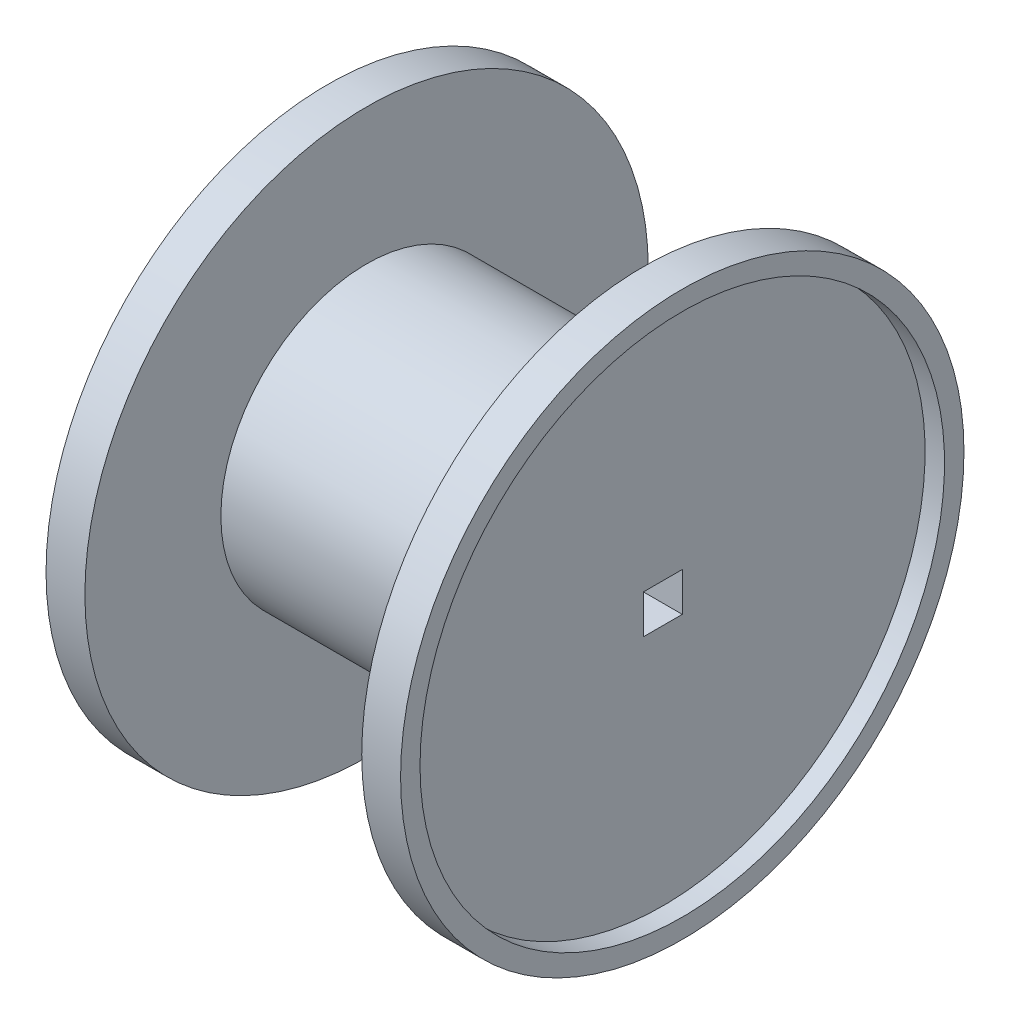
ISO-10303-21;
HEADER;
FILE_DESCRIPTION(('STEP AP214'),'2;1');
FILE_NAME('part.step','',(''),(''),'','','');
FILE_SCHEMA(('AUTOMOTIVE_DESIGN { 1 0 10303 214 1 1 1 1 }'));
ENDSEC;
DATA;
#1=APPLICATION_CONTEXT('core data for automotive mechanical design processes');
#2=APPLICATION_PROTOCOL_DEFINITION('international standard','automotive_design',2000,#1);
#3=PRODUCT_CONTEXT('',#1,'mechanical');
#4=PRODUCT('Part','Part','',(#3));
#5=PRODUCT_RELATED_PRODUCT_CATEGORY('part','',(#4));
#6=PRODUCT_DEFINITION_FORMATION('','',#4);
#7=PRODUCT_DEFINITION_CONTEXT('part definition',#1,'design');
#8=PRODUCT_DEFINITION('design','',#6,#7);
#9=PRODUCT_DEFINITION_SHAPE('','',#8);
#10=(LENGTH_UNIT() NAMED_UNIT(*) SI_UNIT(.MILLI.,.METRE.));
#11=(NAMED_UNIT(*) PLANE_ANGLE_UNIT() SI_UNIT($,.RADIAN.));
#12=(NAMED_UNIT(*) SI_UNIT($,.STERADIAN.) SOLID_ANGLE_UNIT());
#13=UNCERTAINTY_MEASURE_WITH_UNIT(LENGTH_MEASURE(1.E-05),#10,'distance_accuracy_value','');
#14=(GEOMETRIC_REPRESENTATION_CONTEXT(3) GLOBAL_UNCERTAINTY_ASSIGNED_CONTEXT((#13)) GLOBAL_UNIT_ASSIGNED_CONTEXT((#10,
#11,#12)) REPRESENTATION_CONTEXT('',''));
#15=CARTESIAN_POINT('',(0.,0.,0.));
#16=DIRECTION('',(0.,0.,1.));
#17=DIRECTION('',(1.,0.,0.));
#18=AXIS2_PLACEMENT_3D('',#15,#16,#17);
#19=CARTESIAN_POINT('',(0.,0.,0.));
#20=DIRECTION('',(-1.,0.,0.));
#21=DIRECTION('',(0.,0.,1.));
#22=AXIS2_PLACEMENT_3D('',#19,#20,#21);
#23=PLANE('',#22);
#24=DIRECTION('',(0.,-1.,0.));
#25=VECTOR('',#24,1.);
#26=CARTESIAN_POINT('',(0.,20.,-20.));
#27=LINE('',#26,#25);
#28=CARTESIAN_POINT('',(0.,20.,-20.));
#29=VERTEX_POINT('',#28);
#30=CARTESIAN_POINT('',(0.,-20.,-20.));
#31=VERTEX_POINT('',#30);
#32=EDGE_CURVE('E55',#29,#31,#27,.T.);
#33=ORIENTED_EDGE('',*,*,#32,.F.);
#34=DIRECTION('',(0.,0.,-1.));
#35=VECTOR('',#34,1.);
#36=CARTESIAN_POINT('',(0.,20.,-20.));
#37=LINE('',#36,#35);
#38=CARTESIAN_POINT('',(0.,20.,20.));
#39=VERTEX_POINT('',#38);
#40=EDGE_CURVE('E98',#39,#29,#37,.T.);
#41=ORIENTED_EDGE('',*,*,#40,.F.);
#42=DIRECTION('',(0.,1.,0.));
#43=VECTOR('',#42,1.);
#44=CARTESIAN_POINT('',(0.,20.,20.));
#45=LINE('',#44,#43);
#46=CARTESIAN_POINT('',(0.,-20.,20.));
#47=VERTEX_POINT('',#46);
#48=EDGE_CURVE('E83',#47,#39,#45,.T.);
#49=ORIENTED_EDGE('',*,*,#48,.F.);
#50=DIRECTION('',(0.,0.,1.));
#51=VECTOR('',#50,1.);
#52=CARTESIAN_POINT('',(0.,-20.,-20.));
#53=LINE('',#52,#51);
#54=EDGE_CURVE('E92',#31,#47,#53,.T.);
#55=ORIENTED_EDGE('',*,*,#54,.F.);
#56=EDGE_LOOP('',(#33,#41,#49,#55));
#57=FACE_BOUND('',#56,.T.);
#58=CARTESIAN_POINT('',(0.,0.,0.));
#59=DIRECTION('',(-1.,0.,0.));
#60=DIRECTION('',(0.,0.,1.));
#61=AXIS2_PLACEMENT_3D('',#58,#59,#60);
#62=CIRCLE('',#61,270.);
#63=CARTESIAN_POINT('',(0.,0.,270.));
#64=VERTEX_POINT('',#63);
#65=EDGE_CURVE('E105',#64,#64,#62,.T.);
#66=ORIENTED_EDGE('',*,*,#65,.T.);
#67=EDGE_LOOP('',(#66));
#68=FACE_BOUND('',#67,.T.);
#69=ADVANCED_FACE('F41',(#57,#68),#23,.T.);
#70=CARTESIAN_POINT('',(325.,0.,0.));
#71=DIRECTION('',(1.,0.,0.));
#72=DIRECTION('',(0.,0.,-1.));
#73=AXIS2_PLACEMENT_3D('',#70,#71,#72);
#74=PLANE('',#73);
#75=DIRECTION('',(0.,1.,0.));
#76=VECTOR('',#75,1.);
#77=CARTESIAN_POINT('',(325.,0.,-20.));
#78=LINE('',#77,#76);
#79=CARTESIAN_POINT('',(325.,-20.,-20.));
#80=VERTEX_POINT('',#79);
#81=CARTESIAN_POINT('',(325.,20.,-20.));
#82=VERTEX_POINT('',#81);
#83=EDGE_CURVE('E11',#80,#82,#78,.T.);
#84=ORIENTED_EDGE('',*,*,#83,.F.);
#85=DIRECTION('',(0.,0.,-1.));
#86=VECTOR('',#85,1.);
#87=CARTESIAN_POINT('',(325.,-20.,0.));
#88=LINE('',#87,#86);
#89=CARTESIAN_POINT('',(325.,-20.,20.));
#90=VERTEX_POINT('',#89);
#91=EDGE_CURVE('E137',#90,#80,#88,.T.);
#92=ORIENTED_EDGE('',*,*,#91,.F.);
#93=DIRECTION('',(0.,-1.,0.));
#94=VECTOR('',#93,1.);
#95=CARTESIAN_POINT('',(325.,0.,20.));
#96=LINE('',#95,#94);
#97=CARTESIAN_POINT('',(325.,20.,20.));
#98=VERTEX_POINT('',#97);
#99=EDGE_CURVE('E86',#98,#90,#96,.T.);
#100=ORIENTED_EDGE('',*,*,#99,.F.);
#101=DIRECTION('',(0.,0.,1.));
#102=VECTOR('',#101,1.);
#103=CARTESIAN_POINT('',(325.,20.,0.));
#104=LINE('',#103,#102);
#105=EDGE_CURVE('E48',#82,#98,#104,.T.);
#106=ORIENTED_EDGE('',*,*,#105,.F.);
#107=EDGE_LOOP('',(#84,#92,#100,#106));
#108=FACE_BOUND('',#107,.T.);
#109=CARTESIAN_POINT('',(325.,0.,0.));
#110=DIRECTION('',(-1.,0.,0.));
#111=DIRECTION('',(0.,0.,1.));
#112=AXIS2_PLACEMENT_3D('',#109,#110,#111);
#113=CIRCLE('',#112,270.);
#114=CARTESIAN_POINT('',(325.,0.,270.));
#115=VERTEX_POINT('',#114);
#116=EDGE_CURVE('E134',#115,#115,#113,.T.);
#117=ORIENTED_EDGE('',*,*,#116,.F.);
#118=EDGE_LOOP('',(#117));
#119=FACE_BOUND('',#118,.T.);
#120=ADVANCED_FACE('F145',(#108,#119),#74,.T.);
#121=CARTESIAN_POINT('',(0.,0.,0.));
#122=DIRECTION('',(-1.,0.,0.));
#123=DIRECTION('',(0.,0.,1.));
#124=AXIS2_PLACEMENT_3D('',#121,#122,#123);
#125=CYLINDRICAL_SURFACE('',#124,270.);
#126=CARTESIAN_POINT('',(345.,0.,0.));
#127=DIRECTION('',(-1.,0.,0.));
#128=DIRECTION('',(0.,0.,1.));
#129=AXIS2_PLACEMENT_3D('',#126,#127,#128);
#130=CIRCLE('',#129,270.);
#131=CARTESIAN_POINT('',(345.,0.,270.));
#132=VERTEX_POINT('',#131);
#133=EDGE_CURVE('E131',#132,#132,#130,.T.);
#134=ORIENTED_EDGE('',*,*,#133,.F.);
#135=EDGE_LOOP('',(#134));
#136=FACE_BOUND('',#135,.T.);
#137=ORIENTED_EDGE('',*,*,#116,.T.);
#138=EDGE_LOOP('',(#137));
#139=FACE_BOUND('',#138,.T.);
#140=ADVANCED_FACE('F164',(#136,#139),#125,.F.);
#141=CARTESIAN_POINT('',(345.,0.,0.));
#142=DIRECTION('',(1.,0.,0.));
#143=DIRECTION('',(0.,0.,-1.));
#144=AXIS2_PLACEMENT_3D('',#141,#142,#143);
#145=PLANE('',#144);
#146=ORIENTED_EDGE('',*,*,#133,.T.);
#147=EDGE_LOOP('',(#146));
#148=FACE_BOUND('',#147,.T.);
#149=CARTESIAN_POINT('',(345.,0.,0.));
#150=DIRECTION('',(-1.,0.,0.));
#151=DIRECTION('',(0.,0.,1.));
#152=AXIS2_PLACEMENT_3D('',#149,#150,#151);
#153=CIRCLE('',#152,290.);
#154=CARTESIAN_POINT('',(345.,0.,290.));
#155=VERTEX_POINT('',#154);
#156=EDGE_CURVE('E128',#155,#155,#153,.T.);
#157=ORIENTED_EDGE('',*,*,#156,.F.);
#158=EDGE_LOOP('',(#157));
#159=FACE_BOUND('',#158,.T.);
#160=ADVANCED_FACE('F168',(#148,#159),#145,.T.);
#161=CARTESIAN_POINT('',(0.,0.,0.));
#162=DIRECTION('',(-1.,0.,0.));
#163=DIRECTION('',(0.,0.,1.));
#164=AXIS2_PLACEMENT_3D('',#161,#162,#163);
#165=CYLINDRICAL_SURFACE('',#164,290.);
#166=ORIENTED_EDGE('',*,*,#156,.T.);
#167=EDGE_LOOP('',(#166));
#168=FACE_BOUND('',#167,.T.);
#169=CARTESIAN_POINT('',(305.,0.,0.));
#170=DIRECTION('',(-1.,0.,0.));
#171=DIRECTION('',(0.,0.,1.));
#172=AXIS2_PLACEMENT_3D('',#169,#170,#171);
#173=CIRCLE('',#172,290.);
#174=CARTESIAN_POINT('',(305.,0.,290.));
#175=VERTEX_POINT('',#174);
#176=EDGE_CURVE('E125',#175,#175,#173,.T.);
#177=ORIENTED_EDGE('',*,*,#176,.F.);
#178=EDGE_LOOP('',(#177));
#179=FACE_BOUND('',#178,.T.);
#180=ADVANCED_FACE('F174',(#168,#179),#165,.T.);
#181=CARTESIAN_POINT('',(305.,0.,0.));
#182=DIRECTION('',(-1.,0.,0.));
#183=DIRECTION('',(0.,0.,1.));
#184=AXIS2_PLACEMENT_3D('',#181,#182,#183);
#185=PLANE('',#184);
#186=ORIENTED_EDGE('',*,*,#176,.T.);
#187=EDGE_LOOP('',(#186));
#188=FACE_BOUND('',#187,.T.);
#189=CARTESIAN_POINT('',(305.,0.,0.));
#190=DIRECTION('',(-1.,0.,0.));
#191=DIRECTION('',(0.,0.,1.));
#192=AXIS2_PLACEMENT_3D('',#189,#190,#191);
#193=CIRCLE('',#192,150.);
#194=CARTESIAN_POINT('',(305.,0.,150.));
#195=VERTEX_POINT('',#194);
#196=EDGE_CURVE('E122',#195,#195,#193,.T.);
#197=ORIENTED_EDGE('',*,*,#196,.F.);
#198=EDGE_LOOP('',(#197));
#199=FACE_BOUND('',#198,.T.);
#200=ADVANCED_FACE('F178',(#188,#199),#185,.T.);
#201=CARTESIAN_POINT('',(0.,0.,0.));
#202=DIRECTION('',(-1.,0.,0.));
#203=DIRECTION('',(0.,0.,1.));
#204=AXIS2_PLACEMENT_3D('',#201,#202,#203);
#205=CYLINDRICAL_SURFACE('',#204,150.);
#206=ORIENTED_EDGE('',*,*,#196,.T.);
#207=EDGE_LOOP('',(#206));
#208=FACE_BOUND('',#207,.T.);
#209=CARTESIAN_POINT('',(20.,0.,0.));
#210=DIRECTION('',(-1.,0.,0.));
#211=DIRECTION('',(0.,0.,1.));
#212=AXIS2_PLACEMENT_3D('',#209,#210,#211);
#213=CIRCLE('',#212,150.);
#214=CARTESIAN_POINT('',(20.,0.,150.));
#215=VERTEX_POINT('',#214);
#216=EDGE_CURVE('E119',#215,#215,#213,.T.);
#217=ORIENTED_EDGE('',*,*,#216,.F.);
#218=EDGE_LOOP('',(#217));
#219=FACE_BOUND('',#218,.T.);
#220=ADVANCED_FACE('F182',(#208,#219),#205,.T.);
#221=CARTESIAN_POINT('',(20.,0.,0.));
#222=DIRECTION('',(1.,0.,0.));
#223=DIRECTION('',(0.,0.,-1.));
#224=AXIS2_PLACEMENT_3D('',#221,#222,#223);
#225=PLANE('',#224);
#226=ORIENTED_EDGE('',*,*,#216,.T.);
#227=EDGE_LOOP('',(#226));
#228=FACE_BOUND('',#227,.T.);
#229=CARTESIAN_POINT('',(20.,0.,0.));
#230=DIRECTION('',(-1.,0.,0.));
#231=DIRECTION('',(0.,0.,1.));
#232=AXIS2_PLACEMENT_3D('',#229,#230,#231);
#233=CIRCLE('',#232,290.);
#234=CARTESIAN_POINT('',(20.,0.,290.));
#235=VERTEX_POINT('',#234);
#236=EDGE_CURVE('E116',#235,#235,#233,.T.);
#237=ORIENTED_EDGE('',*,*,#236,.F.);
#238=EDGE_LOOP('',(#237));
#239=FACE_BOUND('',#238,.T.);
#240=ADVANCED_FACE('F186',(#228,#239),#225,.T.);
#241=CARTESIAN_POINT('',(0.,0.,0.));
#242=DIRECTION('',(-1.,0.,0.));
#243=DIRECTION('',(0.,0.,1.));
#244=AXIS2_PLACEMENT_3D('',#241,#242,#243);
#245=CYLINDRICAL_SURFACE('',#244,290.);
#246=ORIENTED_EDGE('',*,*,#236,.T.);
#247=EDGE_LOOP('',(#246));
#248=FACE_BOUND('',#247,.T.);
#249=CARTESIAN_POINT('',(-20.,0.,0.));
#250=DIRECTION('',(-1.,0.,0.));
#251=DIRECTION('',(0.,0.,1.));
#252=AXIS2_PLACEMENT_3D('',#249,#250,#251);
#253=CIRCLE('',#252,290.);
#254=CARTESIAN_POINT('',(-20.,0.,290.));
#255=VERTEX_POINT('',#254);
#256=EDGE_CURVE('E113',#255,#255,#253,.T.);
#257=ORIENTED_EDGE('',*,*,#256,.F.);
#258=EDGE_LOOP('',(#257));
#259=FACE_BOUND('',#258,.T.);
#260=ADVANCED_FACE('F190',(#248,#259),#245,.T.);
#261=CARTESIAN_POINT('',(-20.,0.,0.));
#262=DIRECTION('',(1.,0.,0.));
#263=DIRECTION('',(0.,0.,-1.));
#264=AXIS2_PLACEMENT_3D('',#261,#262,#263);
#265=PLANE('',#264);
#266=CARTESIAN_POINT('',(-20.,0.,0.));
#267=DIRECTION('',(-1.,0.,0.));
#268=DIRECTION('',(0.,0.,1.));
#269=AXIS2_PLACEMENT_3D('',#266,#267,#268);
#270=CIRCLE('',#269,270.);
#271=CARTESIAN_POINT('',(-20.,0.,270.));
#272=VERTEX_POINT('',#271);
#273=EDGE_CURVE('E110',#272,#272,#270,.T.);
#274=ORIENTED_EDGE('',*,*,#273,.F.);
#275=EDGE_LOOP('',(#274));
#276=FACE_BOUND('',#275,.T.);
#277=ORIENTED_EDGE('',*,*,#256,.T.);
#278=EDGE_LOOP('',(#277));
#279=FACE_BOUND('',#278,.T.);
#280=ADVANCED_FACE('F156',(#276,#279),#265,.F.);
#281=CARTESIAN_POINT('',(0.,0.,0.));
#282=DIRECTION('',(-1.,0.,0.));
#283=DIRECTION('',(0.,0.,1.));
#284=AXIS2_PLACEMENT_3D('',#281,#282,#283);
#285=CYLINDRICAL_SURFACE('',#284,270.);
#286=ORIENTED_EDGE('',*,*,#273,.T.);
#287=EDGE_LOOP('',(#286));
#288=FACE_BOUND('',#287,.T.);
#289=ORIENTED_EDGE('',*,*,#65,.F.);
#290=EDGE_LOOP('',(#289));
#291=FACE_BOUND('',#290,.T.);
#292=ADVANCED_FACE('F149',(#288,#291),#285,.F.);
#293=CARTESIAN_POINT('',(345.,20.,-20.));
#294=DIRECTION('',(0.,0.,-1.));
#295=DIRECTION('',(0.,1.,0.));
#296=AXIS2_PLACEMENT_3D('',#293,#294,#295);
#297=PLANE('',#296);
#298=ORIENTED_EDGE('',*,*,#83,.T.);
#299=DIRECTION('',(-1.,0.,0.));
#300=VECTOR('',#299,1.);
#301=CARTESIAN_POINT('',(345.,20.,-20.));
#302=LINE('',#301,#300);
#303=EDGE_CURVE('E103',#82,#29,#302,.T.);
#304=ORIENTED_EDGE('',*,*,#303,.T.);
#305=ORIENTED_EDGE('',*,*,#32,.T.);
#306=DIRECTION('',(-1.,0.,0.));
#307=VECTOR('',#306,1.);
#308=CARTESIAN_POINT('',(345.,-20.,-20.));
#309=LINE('',#308,#307);
#310=EDGE_CURVE('E89',#80,#31,#309,.T.);
#311=ORIENTED_EDGE('',*,*,#310,.F.);
#312=EDGE_LOOP('',(#298,#304,#305,#311));
#313=FACE_BOUND('',#312,.T.);
#314=ADVANCED_FACE('F147',(#313),#297,.F.);
#315=CARTESIAN_POINT('',(345.,20.,-20.));
#316=DIRECTION('',(0.,1.,0.));
#317=DIRECTION('',(0.,0.,1.));
#318=AXIS2_PLACEMENT_3D('',#315,#316,#317);
#319=PLANE('',#318);
#320=ORIENTED_EDGE('',*,*,#105,.T.);
#321=DIRECTION('',(-1.,0.,0.));
#322=VECTOR('',#321,1.);
#323=CARTESIAN_POINT('',(345.,20.,20.));
#324=LINE('',#323,#322);
#325=EDGE_CURVE('E88',#98,#39,#324,.T.);
#326=ORIENTED_EDGE('',*,*,#325,.T.);
#327=ORIENTED_EDGE('',*,*,#40,.T.);
#328=ORIENTED_EDGE('',*,*,#303,.F.);
#329=EDGE_LOOP('',(#320,#326,#327,#328));
#330=FACE_BOUND('',#329,.T.);
#331=ADVANCED_FACE('F142',(#330),#319,.F.);
#332=CARTESIAN_POINT('',(345.,20.,20.));
#333=DIRECTION('',(0.,0.,1.));
#334=DIRECTION('',(0.,-1.,0.));
#335=AXIS2_PLACEMENT_3D('',#332,#333,#334);
#336=PLANE('',#335);
#337=ORIENTED_EDGE('',*,*,#99,.T.);
#338=DIRECTION('',(-1.,0.,0.));
#339=VECTOR('',#338,1.);
#340=CARTESIAN_POINT('',(345.,-20.,20.));
#341=LINE('',#340,#339);
#342=EDGE_CURVE('E63',#90,#47,#341,.T.);
#343=ORIENTED_EDGE('',*,*,#342,.T.);
#344=ORIENTED_EDGE('',*,*,#48,.T.);
#345=ORIENTED_EDGE('',*,*,#325,.F.);
#346=EDGE_LOOP('',(#337,#343,#344,#345));
#347=FACE_BOUND('',#346,.T.);
#348=ADVANCED_FACE('F80',(#347),#336,.F.);
#349=CARTESIAN_POINT('',(345.,-20.,-20.));
#350=DIRECTION('',(0.,-1.,0.));
#351=DIRECTION('',(0.,0.,-1.));
#352=AXIS2_PLACEMENT_3D('',#349,#350,#351);
#353=PLANE('',#352);
#354=ORIENTED_EDGE('',*,*,#91,.T.);
#355=ORIENTED_EDGE('',*,*,#310,.T.);
#356=ORIENTED_EDGE('',*,*,#54,.T.);
#357=ORIENTED_EDGE('',*,*,#342,.F.);
#358=EDGE_LOOP('',(#354,#355,#356,#357));
#359=FACE_BOUND('',#358,.T.);
#360=ADVANCED_FACE('F93',(#359),#353,.F.);
#361=CLOSED_SHELL('',(#69,#120,#140,#160,#180,#200,#220,#240,#260,#280,#292,#314,#331,#348,#360));
#362=MANIFOLD_SOLID_BREP('B2',#361);
#363=ADVANCED_BREP_SHAPE_REPRESENTATION('',(#18,#362),#14);
#364=SHAPE_DEFINITION_REPRESENTATION(#9,#363);
ENDSEC;
END-ISO-10303-21;
